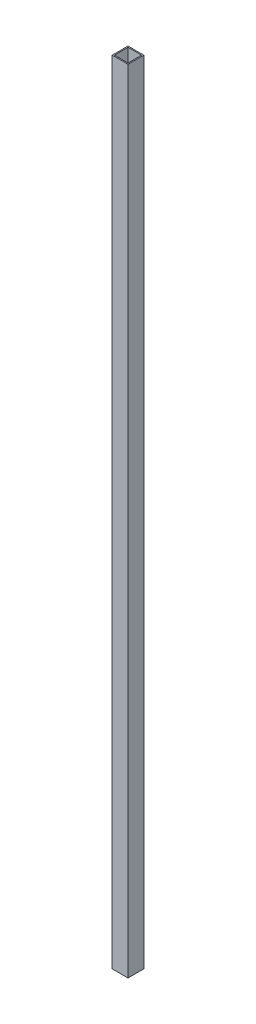
ISO-10303-21;
HEADER;
FILE_DESCRIPTION(('STEP AP214'),'2;1');
FILE_NAME('part.step','',(''),(''),'','','');
FILE_SCHEMA(('AUTOMOTIVE_DESIGN { 1 0 10303 214 1 1 1 1 }'));
ENDSEC;
DATA;
#1=APPLICATION_CONTEXT('core data for automotive mechanical design processes');
#2=APPLICATION_PROTOCOL_DEFINITION('international standard','automotive_design',2000,#1);
#3=PRODUCT_CONTEXT('',#1,'mechanical');
#4=PRODUCT('Part','Part','',(#3));
#5=PRODUCT_RELATED_PRODUCT_CATEGORY('part','',(#4));
#6=PRODUCT_DEFINITION_FORMATION('','',#4);
#7=PRODUCT_DEFINITION_CONTEXT('part definition',#1,'design');
#8=PRODUCT_DEFINITION('design','',#6,#7);
#9=PRODUCT_DEFINITION_SHAPE('','',#8);
#10=(LENGTH_UNIT() NAMED_UNIT(*) SI_UNIT(.MILLI.,.METRE.));
#11=(NAMED_UNIT(*) PLANE_ANGLE_UNIT() SI_UNIT($,.RADIAN.));
#12=(NAMED_UNIT(*) SI_UNIT($,.STERADIAN.) SOLID_ANGLE_UNIT());
#13=UNCERTAINTY_MEASURE_WITH_UNIT(LENGTH_MEASURE(1.E-05),#10,'distance_accuracy_value','');
#14=(GEOMETRIC_REPRESENTATION_CONTEXT(3) GLOBAL_UNCERTAINTY_ASSIGNED_CONTEXT((#13)) GLOBAL_UNIT_ASSIGNED_CONTEXT((#10,
#11,#12)) REPRESENTATION_CONTEXT('',''));
#15=CARTESIAN_POINT('',(0.,0.,0.));
#16=DIRECTION('',(0.,0.,1.));
#17=DIRECTION('',(1.,0.,0.));
#18=AXIS2_PLACEMENT_3D('',#15,#16,#17);
#19=CARTESIAN_POINT('',(0.,2500.,0.));
#20=DIRECTION('',(0.,-1.,0.));
#21=DIRECTION('',(0.,0.,-1.));
#22=AXIS2_PLACEMENT_3D('',#19,#20,#21);
#23=PLANE('',#22);
#24=DIRECTION('',(0.,0.,-1.));
#25=VECTOR('',#24,1.);
#26=CARTESIAN_POINT('',(25.,2500.,25.));
#27=LINE('',#26,#25);
#28=CARTESIAN_POINT('',(25.,2500.,25.));
#29=VERTEX_POINT('',#28);
#30=CARTESIAN_POINT('',(25.,2500.,-25.));
#31=VERTEX_POINT('',#30);
#32=EDGE_CURVE('E134',#29,#31,#27,.T.);
#33=ORIENTED_EDGE('',*,*,#32,.T.);
#34=DIRECTION('',(-1.,0.,0.));
#35=VECTOR('',#34,1.);
#36=CARTESIAN_POINT('',(-25.,2500.,-25.));
#37=LINE('',#36,#35);
#38=CARTESIAN_POINT('',(-25.,2500.,-25.));
#39=VERTEX_POINT('',#38);
#40=EDGE_CURVE('E137',#31,#39,#37,.T.);
#41=ORIENTED_EDGE('',*,*,#40,.T.);
#42=DIRECTION('',(0.,0.,1.));
#43=VECTOR('',#42,1.);
#44=CARTESIAN_POINT('',(-25.,2500.,25.));
#45=LINE('',#44,#43);
#46=CARTESIAN_POINT('',(-25.,2500.,25.));
#47=VERTEX_POINT('',#46);
#48=EDGE_CURVE('E140',#39,#47,#45,.T.);
#49=ORIENTED_EDGE('',*,*,#48,.T.);
#50=DIRECTION('',(1.,0.,0.));
#51=VECTOR('',#50,1.);
#52=CARTESIAN_POINT('',(-25.,2500.,25.));
#53=LINE('',#52,#51);
#54=EDGE_CURVE('E142',#47,#29,#53,.T.);
#55=ORIENTED_EDGE('',*,*,#54,.T.);
#56=EDGE_LOOP('',(#33,#41,#49,#55));
#57=FACE_BOUND('',#56,.T.);
#58=DIRECTION('',(0.,0.,-1.));
#59=VECTOR('',#58,1.);
#60=CARTESIAN_POINT('',(21.5376288397817,2500.,21.5376288397817));
#61=LINE('',#60,#59);
#62=CARTESIAN_POINT('',(21.5376288397817,2500.,21.5376288397817));
#63=VERTEX_POINT('',#62);
#64=CARTESIAN_POINT('',(21.5376288397817,2500.,-21.5376288397817));
#65=VERTEX_POINT('',#64);
#66=EDGE_CURVE('E98',#63,#65,#61,.T.);
#67=ORIENTED_EDGE('',*,*,#66,.F.);
#68=DIRECTION('',(1.,0.,0.));
#69=VECTOR('',#68,1.);
#70=CARTESIAN_POINT('',(-21.5376288397817,2500.,21.5376288397817));
#71=LINE('',#70,#69);
#72=CARTESIAN_POINT('',(-21.5376288397817,2500.,21.5376288397817));
#73=VERTEX_POINT('',#72);
#74=EDGE_CURVE('E120',#73,#63,#71,.T.);
#75=ORIENTED_EDGE('',*,*,#74,.F.);
#76=DIRECTION('',(0.,0.,1.));
#77=VECTOR('',#76,1.);
#78=CARTESIAN_POINT('',(-21.5376288397817,2500.,21.5376288397817));
#79=LINE('',#78,#77);
#80=CARTESIAN_POINT('',(-21.5376288397817,2500.,-21.5376288397817));
#81=VERTEX_POINT('',#80);
#82=EDGE_CURVE('E118',#81,#73,#79,.T.);
#83=ORIENTED_EDGE('',*,*,#82,.F.);
#84=DIRECTION('',(-1.,0.,0.));
#85=VECTOR('',#84,1.);
#86=CARTESIAN_POINT('',(-21.5376288397817,2500.,-21.5376288397817));
#87=LINE('',#86,#85);
#88=EDGE_CURVE('E106',#65,#81,#87,.T.);
#89=ORIENTED_EDGE('',*,*,#88,.F.);
#90=EDGE_LOOP('',(#67,#75,#83,#89));
#91=FACE_BOUND('',#90,.T.);
#92=ADVANCED_FACE('F33',(#57,#91),#23,.F.);
#93=CARTESIAN_POINT('',(0.,0.,0.));
#94=DIRECTION('',(0.,-1.,0.));
#95=DIRECTION('',(0.,0.,-1.));
#96=AXIS2_PLACEMENT_3D('',#93,#94,#95);
#97=PLANE('',#96);
#98=DIRECTION('',(0.,0.,-1.));
#99=VECTOR('',#98,1.);
#100=CARTESIAN_POINT('',(25.,0.,25.));
#101=LINE('',#100,#99);
#102=CARTESIAN_POINT('',(25.,0.,25.));
#103=VERTEX_POINT('',#102);
#104=CARTESIAN_POINT('',(25.,0.,-25.));
#105=VERTEX_POINT('',#104);
#106=EDGE_CURVE('E114',#103,#105,#101,.T.);
#107=ORIENTED_EDGE('',*,*,#106,.F.);
#108=DIRECTION('',(1.,0.,0.));
#109=VECTOR('',#108,1.);
#110=CARTESIAN_POINT('',(-25.,0.,25.));
#111=LINE('',#110,#109);
#112=CARTESIAN_POINT('',(-25.,0.,25.));
#113=VERTEX_POINT('',#112);
#114=EDGE_CURVE('E138',#113,#103,#111,.T.);
#115=ORIENTED_EDGE('',*,*,#114,.F.);
#116=DIRECTION('',(0.,0.,1.));
#117=VECTOR('',#116,1.);
#118=CARTESIAN_POINT('',(-25.,0.,25.));
#119=LINE('',#118,#117);
#120=CARTESIAN_POINT('',(-25.,0.,-25.));
#121=VERTEX_POINT('',#120);
#122=EDGE_CURVE('E149',#121,#113,#119,.T.);
#123=ORIENTED_EDGE('',*,*,#122,.F.);
#124=DIRECTION('',(-1.,0.,0.));
#125=VECTOR('',#124,1.);
#126=CARTESIAN_POINT('',(-25.,0.,-25.));
#127=LINE('',#126,#125);
#128=EDGE_CURVE('E147',#105,#121,#127,.T.);
#129=ORIENTED_EDGE('',*,*,#128,.F.);
#130=EDGE_LOOP('',(#107,#115,#123,#129));
#131=FACE_BOUND('',#130,.T.);
#132=DIRECTION('',(1.,0.,0.));
#133=VECTOR('',#132,1.);
#134=CARTESIAN_POINT('',(-21.5376288397817,0.,21.5376288397817));
#135=LINE('',#134,#133);
#136=CARTESIAN_POINT('',(-21.5376288397817,0.,21.5376288397817));
#137=VERTEX_POINT('',#136);
#138=CARTESIAN_POINT('',(21.5376288397817,0.,21.5376288397817));
#139=VERTEX_POINT('',#138);
#140=EDGE_CURVE('E107',#137,#139,#135,.T.);
#141=ORIENTED_EDGE('',*,*,#140,.T.);
#142=DIRECTION('',(0.,0.,-1.));
#143=VECTOR('',#142,1.);
#144=CARTESIAN_POINT('',(21.5376288397817,0.,21.5376288397817));
#145=LINE('',#144,#143);
#146=CARTESIAN_POINT('',(21.5376288397817,0.,-21.5376288397817));
#147=VERTEX_POINT('',#146);
#148=EDGE_CURVE('E56',#139,#147,#145,.T.);
#149=ORIENTED_EDGE('',*,*,#148,.T.);
#150=DIRECTION('',(-1.,0.,0.));
#151=VECTOR('',#150,1.);
#152=CARTESIAN_POINT('',(-21.5376288397817,0.,-21.5376288397817));
#153=LINE('',#152,#151);
#154=CARTESIAN_POINT('',(-21.5376288397817,0.,-21.5376288397817));
#155=VERTEX_POINT('',#154);
#156=EDGE_CURVE('E113',#147,#155,#153,.T.);
#157=ORIENTED_EDGE('',*,*,#156,.T.);
#158=DIRECTION('',(0.,0.,1.));
#159=VECTOR('',#158,1.);
#160=CARTESIAN_POINT('',(-21.5376288397817,0.,21.5376288397817));
#161=LINE('',#160,#159);
#162=EDGE_CURVE('E126',#155,#137,#161,.T.);
#163=ORIENTED_EDGE('',*,*,#162,.T.);
#164=EDGE_LOOP('',(#141,#149,#157,#163));
#165=FACE_BOUND('',#164,.T.);
#166=ADVANCED_FACE('F167',(#131,#165),#97,.T.);
#167=CARTESIAN_POINT('',(25.,2500.,25.));
#168=DIRECTION('',(-1.,0.,0.));
#169=DIRECTION('',(0.,0.,1.));
#170=AXIS2_PLACEMENT_3D('',#167,#168,#169);
#171=PLANE('',#170);
#172=ORIENTED_EDGE('',*,*,#106,.T.);
#173=DIRECTION('',(0.,-1.,0.));
#174=VECTOR('',#173,1.);
#175=CARTESIAN_POINT('',(25.,2500.,-25.));
#176=LINE('',#175,#174);
#177=EDGE_CURVE('E11',#31,#105,#176,.T.);
#178=ORIENTED_EDGE('',*,*,#177,.F.);
#179=ORIENTED_EDGE('',*,*,#32,.F.);
#180=DIRECTION('',(0.,-1.,0.));
#181=VECTOR('',#180,1.);
#182=CARTESIAN_POINT('',(25.,2500.,25.));
#183=LINE('',#182,#181);
#184=EDGE_CURVE('E144',#29,#103,#183,.T.);
#185=ORIENTED_EDGE('',*,*,#184,.T.);
#186=EDGE_LOOP('',(#172,#178,#179,#185));
#187=FACE_BOUND('',#186,.T.);
#188=ADVANCED_FACE('F35',(#187),#171,.F.);
#189=CARTESIAN_POINT('',(-25.,2500.,-25.));
#190=DIRECTION('',(0.,0.,1.));
#191=DIRECTION('',(1.,0.,0.));
#192=AXIS2_PLACEMENT_3D('',#189,#190,#191);
#193=PLANE('',#192);
#194=ORIENTED_EDGE('',*,*,#128,.T.);
#195=DIRECTION('',(0.,-1.,0.));
#196=VECTOR('',#195,1.);
#197=CARTESIAN_POINT('',(-25.,2500.,-25.));
#198=LINE('',#197,#196);
#199=EDGE_CURVE('E41',#39,#121,#198,.T.);
#200=ORIENTED_EDGE('',*,*,#199,.F.);
#201=ORIENTED_EDGE('',*,*,#40,.F.);
#202=ORIENTED_EDGE('',*,*,#177,.T.);
#203=EDGE_LOOP('',(#194,#200,#201,#202));
#204=FACE_BOUND('',#203,.T.);
#205=ADVANCED_FACE('F177',(#204),#193,.F.);
#206=CARTESIAN_POINT('',(-25.,2500.,25.));
#207=DIRECTION('',(1.,0.,0.));
#208=DIRECTION('',(0.,0.,-1.));
#209=AXIS2_PLACEMENT_3D('',#206,#207,#208);
#210=PLANE('',#209);
#211=ORIENTED_EDGE('',*,*,#122,.T.);
#212=DIRECTION('',(0.,-1.,0.));
#213=VECTOR('',#212,1.);
#214=CARTESIAN_POINT('',(-25.,2500.,25.));
#215=LINE('',#214,#213);
#216=EDGE_CURVE('E154',#47,#113,#215,.T.);
#217=ORIENTED_EDGE('',*,*,#216,.F.);
#218=ORIENTED_EDGE('',*,*,#48,.F.);
#219=ORIENTED_EDGE('',*,*,#199,.T.);
#220=EDGE_LOOP('',(#211,#217,#218,#219));
#221=FACE_BOUND('',#220,.T.);
#222=ADVANCED_FACE('F161',(#221),#210,.F.);
#223=CARTESIAN_POINT('',(-25.,2500.,25.));
#224=DIRECTION('',(0.,0.,-1.));
#225=DIRECTION('',(-1.,0.,0.));
#226=AXIS2_PLACEMENT_3D('',#223,#224,#225);
#227=PLANE('',#226);
#228=ORIENTED_EDGE('',*,*,#114,.T.);
#229=ORIENTED_EDGE('',*,*,#184,.F.);
#230=ORIENTED_EDGE('',*,*,#54,.F.);
#231=ORIENTED_EDGE('',*,*,#216,.T.);
#232=EDGE_LOOP('',(#228,#229,#230,#231));
#233=FACE_BOUND('',#232,.T.);
#234=ADVANCED_FACE('F171',(#233),#227,.F.);
#235=CARTESIAN_POINT('',(21.5376288397817,2500.,21.5376288397817));
#236=DIRECTION('',(-1.,0.,0.));
#237=DIRECTION('',(0.,0.,1.));
#238=AXIS2_PLACEMENT_3D('',#235,#236,#237);
#239=PLANE('',#238);
#240=ORIENTED_EDGE('',*,*,#148,.F.);
#241=DIRECTION('',(0.,-1.,0.));
#242=VECTOR('',#241,1.);
#243=CARTESIAN_POINT('',(21.5376288397817,2500.,21.5376288397817));
#244=LINE('',#243,#242);
#245=EDGE_CURVE('E102',#63,#139,#244,.T.);
#246=ORIENTED_EDGE('',*,*,#245,.F.);
#247=ORIENTED_EDGE('',*,*,#66,.T.);
#248=DIRECTION('',(0.,-1.,0.));
#249=VECTOR('',#248,1.);
#250=CARTESIAN_POINT('',(21.5376288397817,2500.,-21.5376288397817));
#251=LINE('',#250,#249);
#252=EDGE_CURVE('E101',#65,#147,#251,.T.);
#253=ORIENTED_EDGE('',*,*,#252,.T.);
#254=EDGE_LOOP('',(#240,#246,#247,#253));
#255=FACE_BOUND('',#254,.T.);
#256=ADVANCED_FACE('F100',(#255),#239,.T.);
#257=CARTESIAN_POINT('',(-21.5376288397817,2500.,-21.5376288397817));
#258=DIRECTION('',(0.,0.,1.));
#259=DIRECTION('',(1.,0.,0.));
#260=AXIS2_PLACEMENT_3D('',#257,#258,#259);
#261=PLANE('',#260);
#262=ORIENTED_EDGE('',*,*,#156,.F.);
#263=ORIENTED_EDGE('',*,*,#252,.F.);
#264=ORIENTED_EDGE('',*,*,#88,.T.);
#265=DIRECTION('',(0.,-1.,0.));
#266=VECTOR('',#265,1.);
#267=CARTESIAN_POINT('',(-21.5376288397817,2500.,-21.5376288397817));
#268=LINE('',#267,#266);
#269=EDGE_CURVE('E115',#81,#155,#268,.T.);
#270=ORIENTED_EDGE('',*,*,#269,.T.);
#271=EDGE_LOOP('',(#262,#263,#264,#270));
#272=FACE_BOUND('',#271,.T.);
#273=ADVANCED_FACE('F110',(#272),#261,.T.);
#274=CARTESIAN_POINT('',(-21.5376288397817,2500.,21.5376288397817));
#275=DIRECTION('',(1.,0.,0.));
#276=DIRECTION('',(0.,0.,-1.));
#277=AXIS2_PLACEMENT_3D('',#274,#275,#276);
#278=PLANE('',#277);
#279=ORIENTED_EDGE('',*,*,#162,.F.);
#280=ORIENTED_EDGE('',*,*,#269,.F.);
#281=ORIENTED_EDGE('',*,*,#82,.T.);
#282=DIRECTION('',(0.,-1.,0.));
#283=VECTOR('',#282,1.);
#284=CARTESIAN_POINT('',(-21.5376288397817,2500.,21.5376288397817));
#285=LINE('',#284,#283);
#286=EDGE_CURVE('E48',#73,#137,#285,.T.);
#287=ORIENTED_EDGE('',*,*,#286,.T.);
#288=EDGE_LOOP('',(#279,#280,#281,#287));
#289=FACE_BOUND('',#288,.T.);
#290=ADVANCED_FACE('F200',(#289),#278,.T.);
#291=CARTESIAN_POINT('',(-21.5376288397817,2500.,21.5376288397817));
#292=DIRECTION('',(0.,0.,-1.));
#293=DIRECTION('',(-1.,0.,0.));
#294=AXIS2_PLACEMENT_3D('',#291,#292,#293);
#295=PLANE('',#294);
#296=ORIENTED_EDGE('',*,*,#140,.F.);
#297=ORIENTED_EDGE('',*,*,#286,.F.);
#298=ORIENTED_EDGE('',*,*,#74,.T.);
#299=ORIENTED_EDGE('',*,*,#245,.T.);
#300=EDGE_LOOP('',(#296,#297,#298,#299));
#301=FACE_BOUND('',#300,.T.);
#302=ADVANCED_FACE('F204',(#301),#295,.T.);
#303=CLOSED_SHELL('',(#92,#166,#188,#205,#222,#234,#256,#273,#290,#302));
#304=MANIFOLD_SOLID_BREP('B2',#303);
#305=ADVANCED_BREP_SHAPE_REPRESENTATION('',(#18,#304),#14);
#306=SHAPE_DEFINITION_REPRESENTATION(#9,#305);
ENDSEC;
END-ISO-10303-21;
